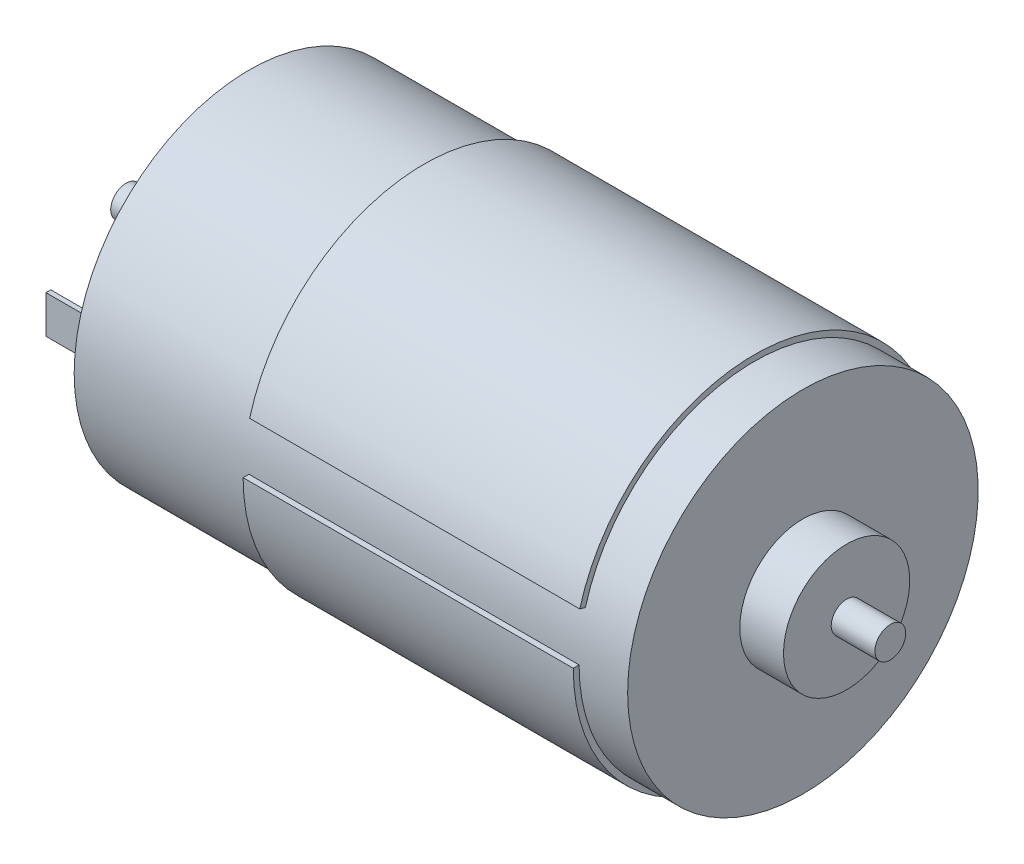
ISO-10303-21;
HEADER;
FILE_DESCRIPTION(('STEP AP214'),'2;1');
FILE_NAME('part.step','',(''),(''),'','','');
FILE_SCHEMA(('AUTOMOTIVE_DESIGN { 1 0 10303 214 1 1 1 1 }'));
ENDSEC;
DATA;
#1=APPLICATION_CONTEXT('core data for automotive mechanical design processes');
#2=APPLICATION_PROTOCOL_DEFINITION('international standard','automotive_design',2000,#1);
#3=PRODUCT_CONTEXT('',#1,'mechanical');
#4=PRODUCT('Part','Part','',(#3));
#5=PRODUCT_RELATED_PRODUCT_CATEGORY('part','',(#4));
#6=PRODUCT_DEFINITION_FORMATION('','',#4);
#7=PRODUCT_DEFINITION_CONTEXT('part definition',#1,'design');
#8=PRODUCT_DEFINITION('design','',#6,#7);
#9=PRODUCT_DEFINITION_SHAPE('','',#8);
#10=(LENGTH_UNIT() NAMED_UNIT(*) SI_UNIT(.MILLI.,.METRE.));
#11=(NAMED_UNIT(*) PLANE_ANGLE_UNIT() SI_UNIT($,.RADIAN.));
#12=(NAMED_UNIT(*) SI_UNIT($,.STERADIAN.) SOLID_ANGLE_UNIT());
#13=UNCERTAINTY_MEASURE_WITH_UNIT(LENGTH_MEASURE(1.E-05),#10,'distance_accuracy_value','');
#14=(GEOMETRIC_REPRESENTATION_CONTEXT(3) GLOBAL_UNCERTAINTY_ASSIGNED_CONTEXT((#13)) GLOBAL_UNIT_ASSIGNED_CONTEXT((#10,
#11,#12)) REPRESENTATION_CONTEXT('',''));
#15=CARTESIAN_POINT('',(0.,0.,0.));
#16=DIRECTION('',(0.,0.,1.));
#17=DIRECTION('',(1.,0.,0.));
#18=AXIS2_PLACEMENT_3D('',#15,#16,#17);
#19=CARTESIAN_POINT('',(-12.7,0.,0.));
#20=DIRECTION('',(-1.,0.,0.));
#21=DIRECTION('',(0.,0.,1.));
#22=AXIS2_PLACEMENT_3D('',#19,#20,#21);
#23=PLANE('',#22);
#24=CARTESIAN_POINT('',(-12.7,0.,0.));
#25=DIRECTION('',(1.,0.,0.));
#26=DIRECTION('',(0.,0.,-1.));
#27=AXIS2_PLACEMENT_3D('',#24,#25,#26);
#28=CIRCLE('',#27,1.5875);
#29=CARTESIAN_POINT('',(-12.7,0.,-1.5875));
#30=VERTEX_POINT('',#29);
#31=EDGE_CURVE('E20',#30,#30,#28,.T.);
#32=ORIENTED_EDGE('',*,*,#31,.F.);
#33=EDGE_LOOP('',(#32));
#34=FACE_BOUND('',#33,.T.);
#35=ADVANCED_FACE('F17',(#34),#23,.T.);
#36=CARTESIAN_POINT('',(-6.7,-1.95,-14.25));
#37=DIRECTION('',(0.,1.,0.));
#38=DIRECTION('',(0.,0.,1.));
#39=AXIS2_PLACEMENT_3D('',#36,#37,#38);
#40=PLANE('',#39);
#41=DIRECTION('',(-1.,0.,0.));
#42=VECTOR('',#41,1.);
#43=CARTESIAN_POINT('',(-6.7,-1.95,-13.75));
#44=LINE('',#43,#42);
#45=CARTESIAN_POINT('',(0.3,-1.95,-13.75));
#46=VERTEX_POINT('',#45);
#47=CARTESIAN_POINT('',(-6.7,-1.95,-13.75));
#48=VERTEX_POINT('',#47);
#49=EDGE_CURVE('E189',#46,#48,#44,.T.);
#50=ORIENTED_EDGE('',*,*,#49,.T.);
#51=DIRECTION('',(0.,0.,-1.));
#52=VECTOR('',#51,1.);
#53=CARTESIAN_POINT('',(-6.7,-1.95,0.));
#54=LINE('',#53,#52);
#55=CARTESIAN_POINT('',(-6.7,-1.95,-14.25));
#56=VERTEX_POINT('',#55);
#57=EDGE_CURVE('E161',#48,#56,#54,.T.);
#58=ORIENTED_EDGE('',*,*,#57,.T.);
#59=DIRECTION('',(1.,0.,0.));
#60=VECTOR('',#59,1.);
#61=CARTESIAN_POINT('',(-6.7,-1.95,-14.25));
#62=LINE('',#61,#60);
#63=CARTESIAN_POINT('',(0.3,-1.95,-14.25));
#64=VERTEX_POINT('',#63);
#65=EDGE_CURVE('E187',#56,#64,#62,.T.);
#66=ORIENTED_EDGE('',*,*,#65,.T.);
#67=DIRECTION('',(0.,0.,1.));
#68=VECTOR('',#67,1.);
#69=CARTESIAN_POINT('',(0.3,-1.95,-14.25));
#70=LINE('',#69,#68);
#71=EDGE_CURVE('E203',#46,#64,#70,.F.);
#72=ORIENTED_EDGE('',*,*,#71,.F.);
#73=EDGE_LOOP('',(#50,#58,#66,#72));
#74=FACE_BOUND('',#73,.T.);
#75=ADVANCED_FACE('F283',(#74),#40,.F.);
#76=CARTESIAN_POINT('',(-6.7,0.,0.));
#77=DIRECTION('',(1.,0.,0.));
#78=DIRECTION('',(0.,0.,-1.));
#79=AXIS2_PLACEMENT_3D('',#76,#77,#78);
#80=PLANE('',#79);
#81=DIRECTION('',(0.,0.,-1.));
#82=VECTOR('',#81,1.);
#83=CARTESIAN_POINT('',(-6.7,1.95,-14.25));
#84=LINE('',#83,#82);
#85=CARTESIAN_POINT('',(-6.7,1.95,-13.75));
#86=VERTEX_POINT('',#85);
#87=CARTESIAN_POINT('',(-6.7,1.95,-14.25));
#88=VERTEX_POINT('',#87);
#89=EDGE_CURVE('E166',#86,#88,#84,.T.);
#90=ORIENTED_EDGE('',*,*,#89,.T.);
#91=DIRECTION('',(0.,1.,0.));
#92=VECTOR('',#91,1.);
#93=CARTESIAN_POINT('',(-6.7,-1.95,-14.25));
#94=LINE('',#93,#92);
#95=EDGE_CURVE('E170',#88,#56,#94,.F.);
#96=ORIENTED_EDGE('',*,*,#95,.T.);
#97=ORIENTED_EDGE('',*,*,#57,.F.);
#98=DIRECTION('',(0.,1.,0.));
#99=VECTOR('',#98,1.);
#100=CARTESIAN_POINT('',(-6.7,-1.95,-13.75));
#101=LINE('',#100,#99);
#102=EDGE_CURVE('E173',#48,#86,#101,.T.);
#103=ORIENTED_EDGE('',*,*,#102,.T.);
#104=EDGE_LOOP('',(#90,#96,#97,#103));
#105=FACE_BOUND('',#104,.T.);
#106=ADVANCED_FACE('F168',(#105),#80,.F.);
#107=CARTESIAN_POINT('',(-6.7,1.95,-14.25));
#108=DIRECTION('',(0.,-1.,0.));
#109=DIRECTION('',(0.,0.,-1.));
#110=AXIS2_PLACEMENT_3D('',#107,#108,#109);
#111=PLANE('',#110);
#112=DIRECTION('',(1.,0.,0.));
#113=VECTOR('',#112,1.);
#114=CARTESIAN_POINT('',(-6.7,1.95,-14.25));
#115=LINE('',#114,#113);
#116=CARTESIAN_POINT('',(0.3,1.95,-14.25));
#117=VERTEX_POINT('',#116);
#118=EDGE_CURVE('E180',#117,#88,#115,.F.);
#119=ORIENTED_EDGE('',*,*,#118,.T.);
#120=ORIENTED_EDGE('',*,*,#89,.F.);
#121=DIRECTION('',(-1.,0.,0.));
#122=VECTOR('',#121,1.);
#123=CARTESIAN_POINT('',(-6.7,1.95,-13.75));
#124=LINE('',#123,#122);
#125=CARTESIAN_POINT('',(0.3,1.95,-13.75));
#126=VERTEX_POINT('',#125);
#127=EDGE_CURVE('E280',#86,#126,#124,.F.);
#128=ORIENTED_EDGE('',*,*,#127,.T.);
#129=DIRECTION('',(0.,0.,-1.));
#130=VECTOR('',#129,1.);
#131=CARTESIAN_POINT('',(0.3,1.95,-14.25));
#132=LINE('',#131,#130);
#133=EDGE_CURVE('E177',#117,#126,#132,.F.);
#134=ORIENTED_EDGE('',*,*,#133,.F.);
#135=EDGE_LOOP('',(#119,#120,#128,#134));
#136=FACE_BOUND('',#135,.T.);
#137=ADVANCED_FACE('F181',(#136),#111,.F.);
#138=CARTESIAN_POINT('',(-6.7,-1.95,13.75));
#139=DIRECTION('',(0.,1.,0.));
#140=DIRECTION('',(0.,0.,1.));
#141=AXIS2_PLACEMENT_3D('',#138,#139,#140);
#142=PLANE('',#141);
#143=DIRECTION('',(-1.,0.,0.));
#144=VECTOR('',#143,1.);
#145=CARTESIAN_POINT('',(-6.7,-1.95,14.25));
#146=LINE('',#145,#144);
#147=CARTESIAN_POINT('',(0.3,-1.95,14.25));
#148=VERTEX_POINT('',#147);
#149=CARTESIAN_POINT('',(-6.7,-1.95,14.25));
#150=VERTEX_POINT('',#149);
#151=EDGE_CURVE('E266',#148,#150,#146,.T.);
#152=ORIENTED_EDGE('',*,*,#151,.T.);
#153=DIRECTION('',(0.,0.,-1.));
#154=VECTOR('',#153,1.);
#155=CARTESIAN_POINT('',(-6.7,-1.95,0.));
#156=LINE('',#155,#154);
#157=CARTESIAN_POINT('',(-6.7,-1.95,13.75));
#158=VERTEX_POINT('',#157);
#159=EDGE_CURVE('E197',#150,#158,#156,.T.);
#160=ORIENTED_EDGE('',*,*,#159,.T.);
#161=DIRECTION('',(1.,0.,0.));
#162=VECTOR('',#161,1.);
#163=CARTESIAN_POINT('',(-6.7,-1.95,13.75));
#164=LINE('',#163,#162);
#165=CARTESIAN_POINT('',(0.3,-1.95,13.75));
#166=VERTEX_POINT('',#165);
#167=EDGE_CURVE('E271',#158,#166,#164,.T.);
#168=ORIENTED_EDGE('',*,*,#167,.T.);
#169=DIRECTION('',(0.,0.,1.));
#170=VECTOR('',#169,1.);
#171=CARTESIAN_POINT('',(0.3,-1.95,13.75));
#172=LINE('',#171,#170);
#173=EDGE_CURVE('E199',#148,#166,#172,.F.);
#174=ORIENTED_EDGE('',*,*,#173,.F.);
#175=EDGE_LOOP('',(#152,#160,#168,#174));
#176=FACE_BOUND('',#175,.T.);
#177=ADVANCED_FACE('F685',(#176),#142,.F.);
#178=CARTESIAN_POINT('',(-6.7,0.,0.));
#179=DIRECTION('',(1.,0.,0.));
#180=DIRECTION('',(0.,0.,-1.));
#181=AXIS2_PLACEMENT_3D('',#178,#179,#180);
#182=PLANE('',#181);
#183=DIRECTION('',(0.,0.,-1.));
#184=VECTOR('',#183,1.);
#185=CARTESIAN_POINT('',(-6.7,1.95,13.75));
#186=LINE('',#185,#184);
#187=CARTESIAN_POINT('',(-6.7,1.95,14.25));
#188=VERTEX_POINT('',#187);
#189=CARTESIAN_POINT('',(-6.7,1.95,13.75));
#190=VERTEX_POINT('',#189);
#191=EDGE_CURVE('E195',#188,#190,#186,.T.);
#192=ORIENTED_EDGE('',*,*,#191,.T.);
#193=DIRECTION('',(0.,1.,0.));
#194=VECTOR('',#193,1.);
#195=CARTESIAN_POINT('',(-6.7,-1.95,13.75));
#196=LINE('',#195,#194);
#197=EDGE_CURVE('E274',#190,#158,#196,.F.);
#198=ORIENTED_EDGE('',*,*,#197,.T.);
#199=ORIENTED_EDGE('',*,*,#159,.F.);
#200=DIRECTION('',(0.,1.,0.));
#201=VECTOR('',#200,1.);
#202=CARTESIAN_POINT('',(-6.7,-1.95,14.25));
#203=LINE('',#202,#201);
#204=EDGE_CURVE('E260',#150,#188,#203,.T.);
#205=ORIENTED_EDGE('',*,*,#204,.T.);
#206=EDGE_LOOP('',(#192,#198,#199,#205));
#207=FACE_BOUND('',#206,.T.);
#208=ADVANCED_FACE('F676',(#207),#182,.F.);
#209=CARTESIAN_POINT('',(-6.7,1.95,13.75));
#210=DIRECTION('',(0.,-1.,0.));
#211=DIRECTION('',(0.,0.,-1.));
#212=AXIS2_PLACEMENT_3D('',#209,#210,#211);
#213=PLANE('',#212);
#214=DIRECTION('',(1.,0.,0.));
#215=VECTOR('',#214,1.);
#216=CARTESIAN_POINT('',(-6.7,1.95,13.75));
#217=LINE('',#216,#215);
#218=CARTESIAN_POINT('',(0.3,1.95,13.75));
#219=VERTEX_POINT('',#218);
#220=EDGE_CURVE('E277',#219,#190,#217,.F.);
#221=ORIENTED_EDGE('',*,*,#220,.T.);
#222=ORIENTED_EDGE('',*,*,#191,.F.);
#223=DIRECTION('',(-1.,0.,0.));
#224=VECTOR('',#223,1.);
#225=CARTESIAN_POINT('',(-6.7,1.95,14.25));
#226=LINE('',#225,#224);
#227=CARTESIAN_POINT('',(0.3,1.95,14.25));
#228=VERTEX_POINT('',#227);
#229=EDGE_CURVE('E254',#188,#228,#226,.F.);
#230=ORIENTED_EDGE('',*,*,#229,.T.);
#231=DIRECTION('',(0.,0.,-1.));
#232=VECTOR('',#231,1.);
#233=CARTESIAN_POINT('',(0.3,1.95,13.75));
#234=LINE('',#233,#232);
#235=EDGE_CURVE('E193',#219,#228,#234,.F.);
#236=ORIENTED_EDGE('',*,*,#235,.F.);
#237=EDGE_LOOP('',(#221,#222,#230,#236));
#238=FACE_BOUND('',#237,.T.);
#239=ADVANCED_FACE('F666',(#238),#213,.F.);
#240=CARTESIAN_POINT('',(-12.7,0.,0.));
#241=DIRECTION('',(1.,0.,0.));
#242=DIRECTION('',(0.,0.,-1.));
#243=AXIS2_PLACEMENT_3D('',#240,#241,#242);
#244=CYLINDRICAL_SURFACE('',#243,1.5875);
#245=CARTESIAN_POINT('',(-2.7,0.,0.));
#246=DIRECTION('',(1.,0.,0.));
#247=DIRECTION('',(0.,0.,-1.));
#248=AXIS2_PLACEMENT_3D('',#245,#246,#247);
#249=CIRCLE('',#248,1.5875);
#250=CARTESIAN_POINT('',(-2.7,0.,-1.5875));
#251=VERTEX_POINT('',#250);
#252=EDGE_CURVE('E251',#251,#251,#249,.T.);
#253=ORIENTED_EDGE('',*,*,#252,.F.);
#254=EDGE_LOOP('',(#253));
#255=FACE_BOUND('',#254,.T.);
#256=ORIENTED_EDGE('',*,*,#31,.T.);
#257=EDGE_LOOP('',(#256));
#258=FACE_BOUND('',#257,.T.);
#259=ADVANCED_FACE('F657',(#255,#258),#244,.T.);
#260=CARTESIAN_POINT('',(-6.7,-1.95,-14.25));
#261=DIRECTION('',(0.,0.,1.));
#262=DIRECTION('',(1.,0.,0.));
#263=AXIS2_PLACEMENT_3D('',#260,#261,#262);
#264=PLANE('',#263);
#265=ORIENTED_EDGE('',*,*,#65,.F.);
#266=ORIENTED_EDGE('',*,*,#95,.F.);
#267=ORIENTED_EDGE('',*,*,#118,.F.);
#268=DIRECTION('',(0.,1.,0.));
#269=VECTOR('',#268,1.);
#270=CARTESIAN_POINT('',(0.3,0.,-14.25));
#271=LINE('',#270,#269);
#272=EDGE_CURVE('E253',#117,#64,#271,.F.);
#273=ORIENTED_EDGE('',*,*,#272,.T.);
#274=EDGE_LOOP('',(#265,#266,#267,#273));
#275=FACE_BOUND('',#274,.T.);
#276=ADVANCED_FACE('F186',(#275),#264,.F.);
#277=CARTESIAN_POINT('',(-6.7,-1.95,-13.75));
#278=DIRECTION('',(0.,0.,-1.));
#279=DIRECTION('',(-1.,0.,0.));
#280=AXIS2_PLACEMENT_3D('',#277,#278,#279);
#281=PLANE('',#280);
#282=ORIENTED_EDGE('',*,*,#127,.F.);
#283=ORIENTED_EDGE('',*,*,#102,.F.);
#284=ORIENTED_EDGE('',*,*,#49,.F.);
#285=DIRECTION('',(0.,1.,0.));
#286=VECTOR('',#285,1.);
#287=CARTESIAN_POINT('',(0.3,0.,-13.75));
#288=LINE('',#287,#286);
#289=EDGE_CURVE('E257',#46,#126,#288,.T.);
#290=ORIENTED_EDGE('',*,*,#289,.T.);
#291=EDGE_LOOP('',(#282,#283,#284,#290));
#292=FACE_BOUND('',#291,.T.);
#293=ADVANCED_FACE('F287',(#292),#281,.F.);
#294=CARTESIAN_POINT('',(-6.7,-1.95,13.75));
#295=DIRECTION('',(0.,0.,1.));
#296=DIRECTION('',(1.,0.,0.));
#297=AXIS2_PLACEMENT_3D('',#294,#295,#296);
#298=PLANE('',#297);
#299=ORIENTED_EDGE('',*,*,#167,.F.);
#300=ORIENTED_EDGE('',*,*,#197,.F.);
#301=ORIENTED_EDGE('',*,*,#220,.F.);
#302=DIRECTION('',(0.,1.,0.));
#303=VECTOR('',#302,1.);
#304=CARTESIAN_POINT('',(0.3,0.,13.75));
#305=LINE('',#304,#303);
#306=EDGE_CURVE('E289',#219,#166,#305,.F.);
#307=ORIENTED_EDGE('',*,*,#306,.T.);
#308=EDGE_LOOP('',(#299,#300,#301,#307));
#309=FACE_BOUND('',#308,.T.);
#310=ADVANCED_FACE('F630',(#309),#298,.F.);
#311=CARTESIAN_POINT('',(-6.7,-1.95,14.25));
#312=DIRECTION('',(0.,0.,-1.));
#313=DIRECTION('',(-1.,0.,0.));
#314=AXIS2_PLACEMENT_3D('',#311,#312,#313);
#315=PLANE('',#314);
#316=ORIENTED_EDGE('',*,*,#229,.F.);
#317=ORIENTED_EDGE('',*,*,#204,.F.);
#318=ORIENTED_EDGE('',*,*,#151,.F.);
#319=DIRECTION('',(0.,1.,0.));
#320=VECTOR('',#319,1.);
#321=CARTESIAN_POINT('',(0.3,0.,14.25));
#322=LINE('',#321,#320);
#323=EDGE_CURVE('E250',#148,#228,#322,.T.);
#324=ORIENTED_EDGE('',*,*,#323,.T.);
#325=EDGE_LOOP('',(#316,#317,#318,#324));
#326=FACE_BOUND('',#325,.T.);
#327=ADVANCED_FACE('F620',(#326),#315,.F.);
#328=CARTESIAN_POINT('',(66.,0.,0.));
#329=DIRECTION('',(1.,0.,0.));
#330=DIRECTION('',(0.,0.,-1.));
#331=AXIS2_PLACEMENT_3D('',#328,#329,#330);
#332=PLANE('',#331);
#333=CARTESIAN_POINT('',(66.,0.,0.));
#334=DIRECTION('',(-1.,0.,0.));
#335=DIRECTION('',(0.,0.,1.));
#336=AXIS2_PLACEMENT_3D('',#333,#334,#335);
#337=CIRCLE('',#336,1.5875);
#338=CARTESIAN_POINT('',(66.,0.,1.5875));
#339=VERTEX_POINT('',#338);
#340=EDGE_CURVE('E248',#339,#339,#337,.T.);
#341=ORIENTED_EDGE('',*,*,#340,.F.);
#342=EDGE_LOOP('',(#341));
#343=FACE_BOUND('',#342,.T.);
#344=ADVANCED_FACE('F610',(#343),#332,.T.);
#345=CARTESIAN_POINT('',(-2.7,0.,0.));
#346=DIRECTION('',(-1.,0.,0.));
#347=DIRECTION('',(0.,0.,1.));
#348=AXIS2_PLACEMENT_3D('',#345,#346,#347);
#349=PLANE('',#348);
#350=CARTESIAN_POINT('',(-2.7,0.,0.));
#351=DIRECTION('',(1.,0.,0.));
#352=DIRECTION('',(0.,0.,-1.));
#353=AXIS2_PLACEMENT_3D('',#350,#351,#352);
#354=CIRCLE('',#353,6.45);
#355=CARTESIAN_POINT('',(-2.7,0.,-6.45));
#356=VERTEX_POINT('',#355);
#357=EDGE_CURVE('E244',#356,#356,#354,.T.);
#358=ORIENTED_EDGE('',*,*,#357,.F.);
#359=EDGE_LOOP('',(#358));
#360=FACE_BOUND('',#359,.T.);
#361=ORIENTED_EDGE('',*,*,#252,.T.);
#362=EDGE_LOOP('',(#361));
#363=FACE_BOUND('',#362,.T.);
#364=ADVANCED_FACE('F601',(#360,#363),#349,.T.);
#365=CARTESIAN_POINT('',(0.3,0.,0.));
#366=DIRECTION('',(1.,0.,0.));
#367=DIRECTION('',(0.,0.,-1.));
#368=AXIS2_PLACEMENT_3D('',#365,#366,#367);
#369=PLANE('',#368);
#370=ORIENTED_EDGE('',*,*,#71,.T.);
#371=ORIENTED_EDGE('',*,*,#272,.F.);
#372=ORIENTED_EDGE('',*,*,#133,.T.);
#373=ORIENTED_EDGE('',*,*,#289,.F.);
#374=EDGE_LOOP('',(#370,#371,#372,#373));
#375=FACE_BOUND('',#374,.T.);
#376=DIRECTION('',(0.,0.,-1.));
#377=VECTOR('',#376,1.);
#378=CARTESIAN_POINT('',(0.3,3.075,-15.425));
#379=LINE('',#378,#377);
#380=CARTESIAN_POINT('',(0.3,3.075,-12.575));
#381=VERTEX_POINT('',#380);
#382=CARTESIAN_POINT('',(0.3,3.075,-15.425));
#383=VERTEX_POINT('',#382);
#384=EDGE_CURVE('E247',#381,#383,#379,.T.);
#385=ORIENTED_EDGE('',*,*,#384,.T.);
#386=DIRECTION('',(0.,1.,0.));
#387=VECTOR('',#386,1.);
#388=CARTESIAN_POINT('',(0.3,-3.075,-15.425));
#389=LINE('',#388,#387);
#390=CARTESIAN_POINT('',(0.3,-3.075,-15.425));
#391=VERTEX_POINT('',#390);
#392=EDGE_CURVE('E306',#383,#391,#389,.F.);
#393=ORIENTED_EDGE('',*,*,#392,.T.);
#394=DIRECTION('',(0.,0.,1.));
#395=VECTOR('',#394,1.);
#396=CARTESIAN_POINT('',(0.3,-3.075,-15.425));
#397=LINE('',#396,#395);
#398=CARTESIAN_POINT('',(0.3,-3.075,-12.575));
#399=VERTEX_POINT('',#398);
#400=EDGE_CURVE('E299',#391,#399,#397,.T.);
#401=ORIENTED_EDGE('',*,*,#400,.T.);
#402=DIRECTION('',(0.,1.,0.));
#403=VECTOR('',#402,1.);
#404=CARTESIAN_POINT('',(0.3,-3.075,-12.575));
#405=LINE('',#404,#403);
#406=EDGE_CURVE('E295',#399,#381,#405,.T.);
#407=ORIENTED_EDGE('',*,*,#406,.T.);
#408=EDGE_LOOP('',(#385,#393,#401,#407));
#409=FACE_BOUND('',#408,.T.);
#410=ADVANCED_FACE('F591',(#375,#409),#369,.F.);
#411=CARTESIAN_POINT('',(0.3,0.,0.));
#412=DIRECTION('',(1.,0.,0.));
#413=DIRECTION('',(0.,0.,-1.));
#414=AXIS2_PLACEMENT_3D('',#411,#412,#413);
#415=PLANE('',#414);
#416=ORIENTED_EDGE('',*,*,#173,.T.);
#417=ORIENTED_EDGE('',*,*,#306,.F.);
#418=ORIENTED_EDGE('',*,*,#235,.T.);
#419=ORIENTED_EDGE('',*,*,#323,.F.);
#420=EDGE_LOOP('',(#416,#417,#418,#419));
#421=FACE_BOUND('',#420,.T.);
#422=DIRECTION('',(0.,0.,-1.));
#423=VECTOR('',#422,1.);
#424=CARTESIAN_POINT('',(0.3,3.075,12.575));
#425=LINE('',#424,#423);
#426=CARTESIAN_POINT('',(0.3,3.075,15.425));
#427=VERTEX_POINT('',#426);
#428=CARTESIAN_POINT('',(0.3,3.075,12.575));
#429=VERTEX_POINT('',#428);
#430=EDGE_CURVE('E310',#427,#429,#425,.T.);
#431=ORIENTED_EDGE('',*,*,#430,.T.);
#432=DIRECTION('',(0.,1.,0.));
#433=VECTOR('',#432,1.);
#434=CARTESIAN_POINT('',(0.3,-3.075,12.575));
#435=LINE('',#434,#433);
#436=CARTESIAN_POINT('',(0.3,-3.075,12.575));
#437=VERTEX_POINT('',#436);
#438=EDGE_CURVE('E323',#429,#437,#435,.F.);
#439=ORIENTED_EDGE('',*,*,#438,.T.);
#440=DIRECTION('',(0.,0.,1.));
#441=VECTOR('',#440,1.);
#442=CARTESIAN_POINT('',(0.3,-3.075,12.575));
#443=LINE('',#442,#441);
#444=CARTESIAN_POINT('',(0.3,-3.075,15.425));
#445=VERTEX_POINT('',#444);
#446=EDGE_CURVE('E316',#437,#445,#443,.T.);
#447=ORIENTED_EDGE('',*,*,#446,.T.);
#448=DIRECTION('',(0.,1.,0.));
#449=VECTOR('',#448,1.);
#450=CARTESIAN_POINT('',(0.3,-3.075,15.425));
#451=LINE('',#450,#449);
#452=EDGE_CURVE('E312',#445,#427,#451,.T.);
#453=ORIENTED_EDGE('',*,*,#452,.T.);
#454=EDGE_LOOP('',(#431,#439,#447,#453));
#455=FACE_BOUND('',#454,.T.);
#456=ADVANCED_FACE('F581',(#421,#455),#415,.F.);
#457=CARTESIAN_POINT('',(66.,0.,0.));
#458=DIRECTION('',(-1.,0.,0.));
#459=DIRECTION('',(0.,0.,1.));
#460=AXIS2_PLACEMENT_3D('',#457,#458,#459);
#461=CYLINDRICAL_SURFACE('',#460,1.5875);
#462=CARTESIAN_POINT('',(61.5,0.,0.));
#463=DIRECTION('',(-1.,0.,0.));
#464=DIRECTION('',(0.,0.,1.));
#465=AXIS2_PLACEMENT_3D('',#462,#463,#464);
#466=CIRCLE('',#465,1.5875);
#467=CARTESIAN_POINT('',(61.5,0.,1.5875));
#468=VERTEX_POINT('',#467);
#469=EDGE_CURVE('E241',#468,#468,#466,.T.);
#470=ORIENTED_EDGE('',*,*,#469,.F.);
#471=EDGE_LOOP('',(#470));
#472=FACE_BOUND('',#471,.T.);
#473=ORIENTED_EDGE('',*,*,#340,.T.);
#474=EDGE_LOOP('',(#473));
#475=FACE_BOUND('',#474,.T.);
#476=ADVANCED_FACE('F571',(#472,#475),#461,.T.);
#477=CARTESIAN_POINT('',(-2.7,0.,0.));
#478=DIRECTION('',(1.,0.,0.));
#479=DIRECTION('',(0.,0.,-1.));
#480=AXIS2_PLACEMENT_3D('',#477,#478,#479);
#481=CYLINDRICAL_SURFACE('',#480,6.45);
#482=CARTESIAN_POINT('',(1.3,0.,0.));
#483=DIRECTION('',(1.,0.,0.));
#484=DIRECTION('',(0.,0.,-1.));
#485=AXIS2_PLACEMENT_3D('',#482,#483,#484);
#486=CIRCLE('',#485,6.45);
#487=CARTESIAN_POINT('',(1.3,0.,-6.45));
#488=VERTEX_POINT('',#487);
#489=EDGE_CURVE('E237',#488,#488,#486,.T.);
#490=ORIENTED_EDGE('',*,*,#489,.F.);
#491=EDGE_LOOP('',(#490));
#492=FACE_BOUND('',#491,.T.);
#493=ORIENTED_EDGE('',*,*,#357,.T.);
#494=EDGE_LOOP('',(#493));
#495=FACE_BOUND('',#494,.T.);
#496=ADVANCED_FACE('F561',(#492,#495),#481,.T.);
#497=CARTESIAN_POINT('',(0.3,3.075,-15.425));
#498=DIRECTION('',(0.,-1.,0.));
#499=DIRECTION('',(0.,0.,-1.));
#500=AXIS2_PLACEMENT_3D('',#497,#498,#499);
#501=PLANE('',#500);
#502=DIRECTION('',(1.,0.,0.));
#503=VECTOR('',#502,1.);
#504=CARTESIAN_POINT('',(0.3,3.075,-15.425));
#505=LINE('',#504,#503);
#506=CARTESIAN_POINT('',(1.3,3.075,-15.425));
#507=VERTEX_POINT('',#506);
#508=EDGE_CURVE('E303',#507,#383,#505,.F.);
#509=ORIENTED_EDGE('',*,*,#508,.T.);
#510=ORIENTED_EDGE('',*,*,#384,.F.);
#511=DIRECTION('',(-1.,0.,0.));
#512=VECTOR('',#511,1.);
#513=CARTESIAN_POINT('',(0.3,3.075,-12.575));
#514=LINE('',#513,#512);
#515=CARTESIAN_POINT('',(1.3,3.075,-12.575));
#516=VERTEX_POINT('',#515);
#517=EDGE_CURVE('E297',#381,#516,#514,.F.);
#518=ORIENTED_EDGE('',*,*,#517,.T.);
#519=DIRECTION('',(0.,0.,1.));
#520=VECTOR('',#519,1.);
#521=CARTESIAN_POINT('',(1.3,3.075,0.));
#522=LINE('',#521,#520);
#523=EDGE_CURVE('E240',#507,#516,#522,.T.);
#524=ORIENTED_EDGE('',*,*,#523,.F.);
#525=EDGE_LOOP('',(#509,#510,#518,#524));
#526=FACE_BOUND('',#525,.T.);
#527=ADVANCED_FACE('F551',(#526),#501,.F.);
#528=CARTESIAN_POINT('',(0.3,-3.075,-12.575));
#529=DIRECTION('',(0.,0.,-1.));
#530=DIRECTION('',(-1.,0.,0.));
#531=AXIS2_PLACEMENT_3D('',#528,#529,#530);
#532=PLANE('',#531);
#533=ORIENTED_EDGE('',*,*,#517,.F.);
#534=ORIENTED_EDGE('',*,*,#406,.F.);
#535=DIRECTION('',(1.,0.,0.));
#536=VECTOR('',#535,1.);
#537=CARTESIAN_POINT('',(0.3,-3.075,-12.575));
#538=LINE('',#537,#536);
#539=CARTESIAN_POINT('',(1.3,-3.075,-12.575));
#540=VERTEX_POINT('',#539);
#541=EDGE_CURVE('E301',#399,#540,#538,.T.);
#542=ORIENTED_EDGE('',*,*,#541,.T.);
#543=DIRECTION('',(0.,1.,0.));
#544=VECTOR('',#543,1.);
#545=CARTESIAN_POINT('',(1.3,0.,-12.575));
#546=LINE('',#545,#544);
#547=EDGE_CURVE('E328',#516,#540,#546,.F.);
#548=ORIENTED_EDGE('',*,*,#547,.F.);
#549=EDGE_LOOP('',(#533,#534,#542,#548));
#550=FACE_BOUND('',#549,.T.);
#551=ADVANCED_FACE('F541',(#550),#532,.F.);
#552=CARTESIAN_POINT('',(0.3,-3.075,-15.425));
#553=DIRECTION('',(0.,1.,0.));
#554=DIRECTION('',(0.,0.,1.));
#555=AXIS2_PLACEMENT_3D('',#552,#553,#554);
#556=PLANE('',#555);
#557=ORIENTED_EDGE('',*,*,#541,.F.);
#558=ORIENTED_EDGE('',*,*,#400,.F.);
#559=DIRECTION('',(1.,0.,0.));
#560=VECTOR('',#559,1.);
#561=CARTESIAN_POINT('',(0.3,-3.075,-15.425));
#562=LINE('',#561,#560);
#563=CARTESIAN_POINT('',(1.3,-3.075,-15.425));
#564=VERTEX_POINT('',#563);
#565=EDGE_CURVE('E308',#391,#564,#562,.T.);
#566=ORIENTED_EDGE('',*,*,#565,.T.);
#567=DIRECTION('',(0.,0.,1.));
#568=VECTOR('',#567,1.);
#569=CARTESIAN_POINT('',(1.3,-3.075,0.));
#570=LINE('',#569,#568);
#571=EDGE_CURVE('E331',#540,#564,#570,.F.);
#572=ORIENTED_EDGE('',*,*,#571,.F.);
#573=EDGE_LOOP('',(#557,#558,#566,#572));
#574=FACE_BOUND('',#573,.T.);
#575=ADVANCED_FACE('F531',(#574),#556,.F.);
#576=CARTESIAN_POINT('',(0.3,-3.075,-15.425));
#577=DIRECTION('',(0.,0.,1.));
#578=DIRECTION('',(1.,0.,0.));
#579=AXIS2_PLACEMENT_3D('',#576,#577,#578);
#580=PLANE('',#579);
#581=ORIENTED_EDGE('',*,*,#565,.F.);
#582=ORIENTED_EDGE('',*,*,#392,.F.);
#583=ORIENTED_EDGE('',*,*,#508,.F.);
#584=DIRECTION('',(0.,1.,0.));
#585=VECTOR('',#584,1.);
#586=CARTESIAN_POINT('',(1.3,0.,-15.425));
#587=LINE('',#586,#585);
#588=EDGE_CURVE('E334',#564,#507,#587,.T.);
#589=ORIENTED_EDGE('',*,*,#588,.F.);
#590=EDGE_LOOP('',(#581,#582,#583,#589));
#591=FACE_BOUND('',#590,.T.);
#592=ADVANCED_FACE('F521',(#591),#580,.F.);
#593=CARTESIAN_POINT('',(0.3,3.075,12.575));
#594=DIRECTION('',(0.,-1.,0.));
#595=DIRECTION('',(0.,0.,-1.));
#596=AXIS2_PLACEMENT_3D('',#593,#594,#595);
#597=PLANE('',#596);
#598=DIRECTION('',(1.,0.,0.));
#599=VECTOR('',#598,1.);
#600=CARTESIAN_POINT('',(0.3,3.075,12.575));
#601=LINE('',#600,#599);
#602=CARTESIAN_POINT('',(1.3,3.075,12.575));
#603=VERTEX_POINT('',#602);
#604=EDGE_CURVE('E320',#603,#429,#601,.F.);
#605=ORIENTED_EDGE('',*,*,#604,.T.);
#606=ORIENTED_EDGE('',*,*,#430,.F.);
#607=DIRECTION('',(-1.,0.,0.));
#608=VECTOR('',#607,1.);
#609=CARTESIAN_POINT('',(0.3,3.075,15.425));
#610=LINE('',#609,#608);
#611=CARTESIAN_POINT('',(1.3,3.075,15.425));
#612=VERTEX_POINT('',#611);
#613=EDGE_CURVE('E314',#427,#612,#610,.F.);
#614=ORIENTED_EDGE('',*,*,#613,.T.);
#615=DIRECTION('',(0.,0.,1.));
#616=VECTOR('',#615,1.);
#617=CARTESIAN_POINT('',(1.3,3.075,0.));
#618=LINE('',#617,#616);
#619=EDGE_CURVE('E337',#603,#612,#618,.T.);
#620=ORIENTED_EDGE('',*,*,#619,.F.);
#621=EDGE_LOOP('',(#605,#606,#614,#620));
#622=FACE_BOUND('',#621,.T.);
#623=ADVANCED_FACE('F511',(#622),#597,.F.);
#624=CARTESIAN_POINT('',(0.3,-3.075,15.425));
#625=DIRECTION('',(0.,0.,-1.));
#626=DIRECTION('',(-1.,0.,0.));
#627=AXIS2_PLACEMENT_3D('',#624,#625,#626);
#628=PLANE('',#627);
#629=ORIENTED_EDGE('',*,*,#613,.F.);
#630=ORIENTED_EDGE('',*,*,#452,.F.);
#631=DIRECTION('',(1.,0.,0.));
#632=VECTOR('',#631,1.);
#633=CARTESIAN_POINT('',(0.3,-3.075,15.425));
#634=LINE('',#633,#632);
#635=CARTESIAN_POINT('',(1.3,-3.075,15.425));
#636=VERTEX_POINT('',#635);
#637=EDGE_CURVE('E318',#445,#636,#634,.T.);
#638=ORIENTED_EDGE('',*,*,#637,.T.);
#639=DIRECTION('',(0.,1.,0.));
#640=VECTOR('',#639,1.);
#641=CARTESIAN_POINT('',(1.3,0.,15.425));
#642=LINE('',#641,#640);
#643=EDGE_CURVE('E340',#612,#636,#642,.F.);
#644=ORIENTED_EDGE('',*,*,#643,.F.);
#645=EDGE_LOOP('',(#629,#630,#638,#644));
#646=FACE_BOUND('',#645,.T.);
#647=ADVANCED_FACE('F502',(#646),#628,.F.);
#648=CARTESIAN_POINT('',(0.3,-3.075,12.575));
#649=DIRECTION('',(0.,1.,0.));
#650=DIRECTION('',(0.,0.,1.));
#651=AXIS2_PLACEMENT_3D('',#648,#649,#650);
#652=PLANE('',#651);
#653=ORIENTED_EDGE('',*,*,#637,.F.);
#654=ORIENTED_EDGE('',*,*,#446,.F.);
#655=DIRECTION('',(1.,0.,0.));
#656=VECTOR('',#655,1.);
#657=CARTESIAN_POINT('',(0.3,-3.075,12.575));
#658=LINE('',#657,#656);
#659=CARTESIAN_POINT('',(1.3,-3.075,12.575));
#660=VERTEX_POINT('',#659);
#661=EDGE_CURVE('E68',#437,#660,#658,.T.);
#662=ORIENTED_EDGE('',*,*,#661,.T.);
#663=DIRECTION('',(0.,0.,1.));
#664=VECTOR('',#663,1.);
#665=CARTESIAN_POINT('',(1.3,-3.075,0.));
#666=LINE('',#665,#664);
#667=EDGE_CURVE('E343',#636,#660,#666,.F.);
#668=ORIENTED_EDGE('',*,*,#667,.F.);
#669=EDGE_LOOP('',(#653,#654,#662,#668));
#670=FACE_BOUND('',#669,.T.);
#671=ADVANCED_FACE('F492',(#670),#652,.F.);
#672=CARTESIAN_POINT('',(0.3,-3.075,12.575));
#673=DIRECTION('',(0.,0.,1.));
#674=DIRECTION('',(1.,0.,0.));
#675=AXIS2_PLACEMENT_3D('',#672,#673,#674);
#676=PLANE('',#675);
#677=ORIENTED_EDGE('',*,*,#661,.F.);
#678=ORIENTED_EDGE('',*,*,#438,.F.);
#679=ORIENTED_EDGE('',*,*,#604,.F.);
#680=DIRECTION('',(0.,1.,0.));
#681=VECTOR('',#680,1.);
#682=CARTESIAN_POINT('',(1.3,0.,12.575));
#683=LINE('',#682,#681);
#684=EDGE_CURVE('E236',#660,#603,#683,.T.);
#685=ORIENTED_EDGE('',*,*,#684,.F.);
#686=EDGE_LOOP('',(#677,#678,#679,#685));
#687=FACE_BOUND('',#686,.T.);
#688=ADVANCED_FACE('F482',(#687),#676,.F.);
#689=CARTESIAN_POINT('',(61.5,0.,0.));
#690=DIRECTION('',(1.,0.,0.));
#691=DIRECTION('',(0.,0.,-1.));
#692=AXIS2_PLACEMENT_3D('',#689,#690,#691);
#693=PLANE('',#692);
#694=CARTESIAN_POINT('',(61.5,0.,0.));
#695=DIRECTION('',(-1.,0.,0.));
#696=DIRECTION('',(0.,0.,1.));
#697=AXIS2_PLACEMENT_3D('',#694,#695,#696);
#698=CIRCLE('',#697,6.5);
#699=CARTESIAN_POINT('',(61.5,0.,6.5));
#700=VERTEX_POINT('',#699);
#701=EDGE_CURVE('E233',#700,#700,#698,.T.);
#702=ORIENTED_EDGE('',*,*,#701,.F.);
#703=EDGE_LOOP('',(#702));
#704=FACE_BOUND('',#703,.T.);
#705=ORIENTED_EDGE('',*,*,#469,.T.);
#706=EDGE_LOOP('',(#705));
#707=FACE_BOUND('',#706,.T.);
#708=ADVANCED_FACE('F472',(#704,#707),#693,.T.);
#709=CARTESIAN_POINT('',(1.3,0.,0.));
#710=DIRECTION('',(-1.,0.,0.));
#711=DIRECTION('',(0.,0.,1.));
#712=AXIS2_PLACEMENT_3D('',#709,#710,#711);
#713=PLANE('',#712);
#714=ORIENTED_EDGE('',*,*,#667,.T.);
#715=ORIENTED_EDGE('',*,*,#684,.T.);
#716=ORIENTED_EDGE('',*,*,#619,.T.);
#717=ORIENTED_EDGE('',*,*,#643,.T.);
#718=EDGE_LOOP('',(#714,#715,#716,#717));
#719=FACE_BOUND('',#718,.T.);
#720=ORIENTED_EDGE('',*,*,#571,.T.);
#721=ORIENTED_EDGE('',*,*,#588,.T.);
#722=ORIENTED_EDGE('',*,*,#523,.T.);
#723=ORIENTED_EDGE('',*,*,#547,.T.);
#724=EDGE_LOOP('',(#720,#721,#722,#723));
#725=FACE_BOUND('',#724,.T.);
#726=CARTESIAN_POINT('',(1.3,0.,0.));
#727=DIRECTION('',(-1.,0.,0.));
#728=DIRECTION('',(0.,0.,1.));
#729=AXIS2_PLACEMENT_3D('',#726,#727,#728);
#730=CIRCLE('',#729,17.35);
#731=CARTESIAN_POINT('',(1.3,0.,17.35));
#732=VERTEX_POINT('',#731);
#733=EDGE_CURVE('E230',#732,#732,#730,.T.);
#734=ORIENTED_EDGE('',*,*,#733,.T.);
#735=EDGE_LOOP('',(#734));
#736=FACE_BOUND('',#735,.T.);
#737=ORIENTED_EDGE('',*,*,#489,.T.);
#738=EDGE_LOOP('',(#737));
#739=FACE_BOUND('',#738,.T.);
#740=ADVANCED_FACE('F462',(#719,#725,#736,#739),#713,.T.);
#741=CARTESIAN_POINT('',(61.5,0.,0.));
#742=DIRECTION('',(-1.,0.,0.));
#743=DIRECTION('',(0.,0.,1.));
#744=AXIS2_PLACEMENT_3D('',#741,#742,#743);
#745=CYLINDRICAL_SURFACE('',#744,6.5);
#746=CARTESIAN_POINT('',(57.,0.,0.));
#747=DIRECTION('',(-1.,0.,0.));
#748=DIRECTION('',(0.,0.,1.));
#749=AXIS2_PLACEMENT_3D('',#746,#747,#748);
#750=CIRCLE('',#749,6.5);
#751=CARTESIAN_POINT('',(57.,0.,6.5));
#752=VERTEX_POINT('',#751);
#753=EDGE_CURVE('E227',#752,#752,#750,.T.);
#754=ORIENTED_EDGE('',*,*,#753,.F.);
#755=EDGE_LOOP('',(#754));
#756=FACE_BOUND('',#755,.T.);
#757=ORIENTED_EDGE('',*,*,#701,.T.);
#758=EDGE_LOOP('',(#757));
#759=FACE_BOUND('',#758,.T.);
#760=ADVANCED_FACE('F452',(#756,#759),#745,.T.);
#761=CARTESIAN_POINT('',(1.3,0.,0.));
#762=DIRECTION('',(-1.,0.,0.));
#763=DIRECTION('',(0.,0.,1.));
#764=AXIS2_PLACEMENT_3D('',#761,#762,#763);
#765=CYLINDRICAL_SURFACE('',#764,17.35);
#766=ORIENTED_EDGE('',*,*,#733,.F.);
#767=EDGE_LOOP('',(#766));
#768=FACE_BOUND('',#767,.T.);
#769=CARTESIAN_POINT('',(0.,0.,0.));
#770=DIRECTION('',(-1.,0.,0.));
#771=DIRECTION('',(0.,0.,1.));
#772=AXIS2_PLACEMENT_3D('',#769,#770,#771);
#773=CIRCLE('',#772,17.35);
#774=CARTESIAN_POINT('',(0.,0.,17.35));
#775=VERTEX_POINT('',#774);
#776=EDGE_CURVE('E224',#775,#775,#773,.T.);
#777=ORIENTED_EDGE('',*,*,#776,.T.);
#778=EDGE_LOOP('',(#777));
#779=FACE_BOUND('',#778,.T.);
#780=ADVANCED_FACE('F442',(#768,#779),#765,.F.);
#781=CARTESIAN_POINT('',(57.,0.,0.));
#782=DIRECTION('',(1.,0.,0.));
#783=DIRECTION('',(0.,0.,-1.));
#784=AXIS2_PLACEMENT_3D('',#781,#782,#783);
#785=PLANE('',#784);
#786=CARTESIAN_POINT('',(57.,0.,0.));
#787=DIRECTION('',(-1.,0.,0.));
#788=DIRECTION('',(0.,0.,1.));
#789=AXIS2_PLACEMENT_3D('',#786,#787,#788);
#790=CIRCLE('',#789,18.05);
#791=CARTESIAN_POINT('',(57.,0.,18.05));
#792=VERTEX_POINT('',#791);
#793=EDGE_CURVE('E220',#792,#792,#790,.T.);
#794=ORIENTED_EDGE('',*,*,#793,.F.);
#795=EDGE_LOOP('',(#794));
#796=FACE_BOUND('',#795,.T.);
#797=ORIENTED_EDGE('',*,*,#753,.T.);
#798=EDGE_LOOP('',(#797));
#799=FACE_BOUND('',#798,.T.);
#800=ADVANCED_FACE('F432',(#796,#799),#785,.T.);
#801=CARTESIAN_POINT('',(0.,0.,0.));
#802=DIRECTION('',(1.,0.,0.));
#803=DIRECTION('',(0.,0.,-1.));
#804=AXIS2_PLACEMENT_3D('',#801,#802,#803);
#805=PLANE('',#804);
#806=CARTESIAN_POINT('',(0.,0.,0.));
#807=DIRECTION('',(-1.,0.,0.));
#808=DIRECTION('',(0.,0.,1.));
#809=AXIS2_PLACEMENT_3D('',#806,#807,#808);
#810=CIRCLE('',#809,18.05);
#811=CARTESIAN_POINT('',(0.,0.,18.05));
#812=VERTEX_POINT('',#811);
#813=EDGE_CURVE('E217',#812,#812,#810,.F.);
#814=ORIENTED_EDGE('',*,*,#813,.F.);
#815=EDGE_LOOP('',(#814));
#816=FACE_BOUND('',#815,.T.);
#817=ORIENTED_EDGE('',*,*,#776,.F.);
#818=EDGE_LOOP('',(#817));
#819=FACE_BOUND('',#818,.T.);
#820=ADVANCED_FACE('F423',(#816,#819),#805,.F.);
#821=CARTESIAN_POINT('',(18.,4.79546789149172,17.4013214355023));
#822=DIRECTION('',(0.,0.96406212939071,-0.265676891495385));
#823=DIRECTION('',(0.,0.265676891495385,0.96406212939071));
#824=AXIS2_PLACEMENT_3D('',#821,#822,#823);
#825=PLANE('',#824);
#826=DIRECTION('',(1.,0.,0.));
#827=VECTOR('',#826,1.);
#828=CARTESIAN_POINT('',(18.,4.95487402638895,17.9797587131367));
#829=LINE('',#828,#827);
#830=CARTESIAN_POINT('',(18.,4.95487402638895,17.9797587131367));
#831=VERTEX_POINT('',#830);
#832=CARTESIAN_POINT('',(52.,4.95487402638895,17.9797587131367));
#833=VERTEX_POINT('',#832);
#834=EDGE_CURVE('E212',#831,#833,#829,.T.);
#835=ORIENTED_EDGE('',*,*,#834,.F.);
#836=DIRECTION('',(0.,0.265676891495385,0.96406212939071));
#837=VECTOR('',#836,1.);
#838=CARTESIAN_POINT('',(18.,4.79546789149172,17.4013214355023));
#839=LINE('',#838,#837);
#840=CARTESIAN_POINT('',(18.,4.79546789149172,17.4013214355023));
#841=VERTEX_POINT('',#840);
#842=EDGE_CURVE('E216',#841,#831,#839,.T.);
#843=ORIENTED_EDGE('',*,*,#842,.F.);
#844=DIRECTION('',(-1.,0.,0.));
#845=VECTOR('',#844,1.);
#846=CARTESIAN_POINT('',(57.,4.79546789149172,17.4013214355023));
#847=LINE('',#846,#845);
#848=CARTESIAN_POINT('',(52.,4.79546789149172,17.4013214355023));
#849=VERTEX_POINT('',#848);
#850=EDGE_CURVE('E59',#849,#841,#847,.T.);
#851=ORIENTED_EDGE('',*,*,#850,.F.);
#852=DIRECTION('',(0.,0.265676891495385,0.96406212939071));
#853=VECTOR('',#852,1.);
#854=CARTESIAN_POINT('',(52.,4.79546789149172,17.4013214355023));
#855=LINE('',#854,#853);
#856=EDGE_CURVE('E223',#833,#849,#855,.F.);
#857=ORIENTED_EDGE('',*,*,#856,.F.);
#858=EDGE_LOOP('',(#835,#843,#851,#857));
#859=FACE_BOUND('',#858,.T.);
#860=ADVANCED_FACE('F365',(#859),#825,.F.);
#861=CARTESIAN_POINT('',(57.,0.,0.));
#862=DIRECTION('',(-1.,0.,0.));
#863=DIRECTION('',(0.,0.,1.));
#864=AXIS2_PLACEMENT_3D('',#861,#862,#863);
#865=CYLINDRICAL_SURFACE('',#864,18.05);
#866=CARTESIAN_POINT('',(52.,0.,0.));
#867=DIRECTION('',(-1.,0.,0.));
#868=DIRECTION('',(0.,0.,1.));
#869=AXIS2_PLACEMENT_3D('',#866,#867,#868);
#870=CIRCLE('',#869,18.05);
#871=CARTESIAN_POINT('',(52.,0.,18.05));
#872=VERTEX_POINT('',#871);
#873=EDGE_CURVE('E209',#872,#849,#870,.F.);
#874=ORIENTED_EDGE('',*,*,#873,.T.);
#875=ORIENTED_EDGE('',*,*,#850,.T.);
#876=CARTESIAN_POINT('',(18.,0.,0.));
#877=DIRECTION('',(-1.,0.,0.));
#878=DIRECTION('',(0.,0.,1.));
#879=AXIS2_PLACEMENT_3D('',#876,#877,#878);
#880=CIRCLE('',#879,18.05);
#881=CARTESIAN_POINT('',(18.,0.,18.05));
#882=VERTEX_POINT('',#881);
#883=EDGE_CURVE('E213',#882,#841,#880,.F.);
#884=ORIENTED_EDGE('',*,*,#883,.F.);
#885=DIRECTION('',(1.,0.,0.));
#886=VECTOR('',#885,1.);
#887=CARTESIAN_POINT('',(18.,0.,18.05));
#888=LINE('',#887,#886);
#889=EDGE_CURVE('E353',#882,#872,#888,.T.);
#890=ORIENTED_EDGE('',*,*,#889,.T.);
#891=EDGE_LOOP('',(#874,#875,#884,#890));
#892=FACE_BOUND('',#891,.T.);
#893=ORIENTED_EDGE('',*,*,#813,.T.);
#894=EDGE_LOOP('',(#893));
#895=FACE_BOUND('',#894,.T.);
#896=ORIENTED_EDGE('',*,*,#793,.T.);
#897=EDGE_LOOP('',(#896));
#898=FACE_BOUND('',#897,.T.);
#899=ADVANCED_FACE('F371',(#892,#895,#898),#865,.T.);
#900=CARTESIAN_POINT('',(18.,0.,0.));
#901=DIRECTION('',(-1.,0.,0.));
#902=DIRECTION('',(0.,0.,1.));
#903=AXIS2_PLACEMENT_3D('',#900,#901,#902);
#904=PLANE('',#903);
#905=CARTESIAN_POINT('',(18.,0.,0.));
#906=DIRECTION('',(1.,0.,0.));
#907=DIRECTION('',(0.,0.,-1.));
#908=AXIS2_PLACEMENT_3D('',#905,#906,#907);
#909=CIRCLE('',#908,18.65);
#910=CARTESIAN_POINT('',(18.,0.,18.65));
#911=VERTEX_POINT('',#910);
#912=EDGE_CURVE('E207',#911,#831,#909,.T.);
#913=ORIENTED_EDGE('',*,*,#912,.F.);
#914=DIRECTION('',(0.,0.,-1.));
#915=VECTOR('',#914,1.);
#916=CARTESIAN_POINT('',(18.,0.,18.05));
#917=LINE('',#916,#915);
#918=EDGE_CURVE('E211',#911,#882,#917,.T.);
#919=ORIENTED_EDGE('',*,*,#918,.T.);
#920=ORIENTED_EDGE('',*,*,#883,.T.);
#921=ORIENTED_EDGE('',*,*,#842,.T.);
#922=EDGE_LOOP('',(#913,#919,#920,#921));
#923=FACE_BOUND('',#922,.T.);
#924=ADVANCED_FACE('F361',(#923),#904,.T.);
#925=CARTESIAN_POINT('',(52.,0.,0.));
#926=DIRECTION('',(-1.,0.,0.));
#927=DIRECTION('',(0.,0.,1.));
#928=AXIS2_PLACEMENT_3D('',#925,#926,#927);
#929=PLANE('',#928);
#930=DIRECTION('',(0.,0.,-1.));
#931=VECTOR('',#930,1.);
#932=CARTESIAN_POINT('',(52.,0.,18.05));
#933=LINE('',#932,#931);
#934=CARTESIAN_POINT('',(52.,0.,18.65));
#935=VERTEX_POINT('',#934);
#936=EDGE_CURVE('E35',#872,#935,#933,.F.);
#937=ORIENTED_EDGE('',*,*,#936,.T.);
#938=CARTESIAN_POINT('',(52.,0.,0.));
#939=DIRECTION('',(1.,0.,0.));
#940=DIRECTION('',(0.,0.,-1.));
#941=AXIS2_PLACEMENT_3D('',#938,#939,#940);
#942=CIRCLE('',#941,18.65);
#943=EDGE_CURVE('E26',#833,#935,#942,.F.);
#944=ORIENTED_EDGE('',*,*,#943,.F.);
#945=ORIENTED_EDGE('',*,*,#856,.T.);
#946=ORIENTED_EDGE('',*,*,#873,.F.);
#947=EDGE_LOOP('',(#937,#944,#945,#946));
#948=FACE_BOUND('',#947,.T.);
#949=ADVANCED_FACE('F373',(#948),#929,.F.);
#950=CARTESIAN_POINT('',(18.,0.,18.05));
#951=DIRECTION('',(0.,-1.,0.));
#952=DIRECTION('',(0.,0.,-1.));
#953=AXIS2_PLACEMENT_3D('',#950,#951,#952);
#954=PLANE('',#953);
#955=ORIENTED_EDGE('',*,*,#889,.F.);
#956=ORIENTED_EDGE('',*,*,#918,.F.);
#957=DIRECTION('',(1.,0.,0.));
#958=VECTOR('',#957,1.);
#959=CARTESIAN_POINT('',(18.,0.,18.65));
#960=LINE('',#959,#958);
#961=EDGE_CURVE('E11',#935,#911,#960,.F.);
#962=ORIENTED_EDGE('',*,*,#961,.F.);
#963=ORIENTED_EDGE('',*,*,#936,.F.);
#964=EDGE_LOOP('',(#955,#956,#962,#963));
#965=FACE_BOUND('',#964,.T.);
#966=ADVANCED_FACE('F370',(#965),#954,.F.);
#967=CARTESIAN_POINT('',(18.,0.,0.));
#968=DIRECTION('',(1.,0.,0.));
#969=DIRECTION('',(0.,0.,-1.));
#970=AXIS2_PLACEMENT_3D('',#967,#968,#969);
#971=CYLINDRICAL_SURFACE('',#970,18.65);
#972=ORIENTED_EDGE('',*,*,#943,.T.);
#973=ORIENTED_EDGE('',*,*,#961,.T.);
#974=ORIENTED_EDGE('',*,*,#912,.T.);
#975=ORIENTED_EDGE('',*,*,#834,.T.);
#976=EDGE_LOOP('',(#972,#973,#974,#975));
#977=FACE_BOUND('',#976,.T.);
#978=ADVANCED_FACE('F367',(#977),#971,.T.);
#979=CLOSED_SHELL('',(#35,#75,#106,#137,#177,#208,#239,#259,#276,#293,#310,#327,#344,#364,#410,
#456,#476,#496,#527,#551,#575,#592,#623,#647,#671,#688,#708,#740,#760,#780,#800,#820,#860,#899,
#924,#949,#966,#978));
#980=MANIFOLD_SOLID_BREP('B1',#979);
#981=ADVANCED_BREP_SHAPE_REPRESENTATION('',(#18,#980),#14);
#982=SHAPE_DEFINITION_REPRESENTATION(#9,#981);
ENDSEC;
END-ISO-10303-21;
